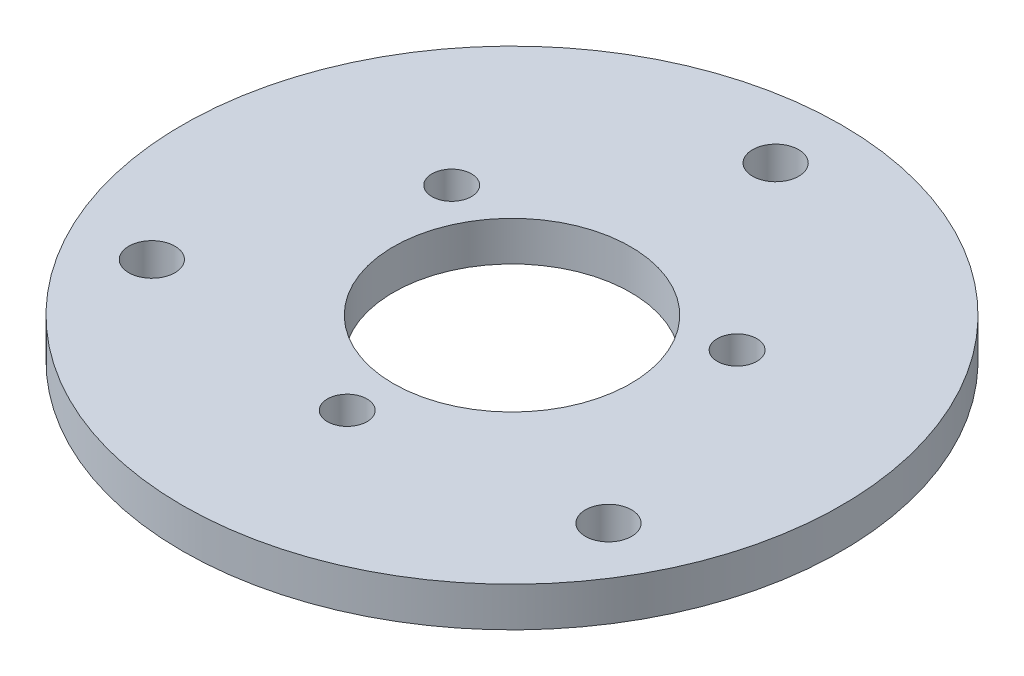
ISO-10303-21;
HEADER;
FILE_DESCRIPTION(('STEP AP214'),'2;1');
FILE_NAME('part.step','',(''),(''),'','','');
FILE_SCHEMA(('AUTOMOTIVE_DESIGN { 1 0 10303 214 1 1 1 1 }'));
ENDSEC;
DATA;
#1=APPLICATION_CONTEXT('core data for automotive mechanical design processes');
#2=APPLICATION_PROTOCOL_DEFINITION('international standard','automotive_design',2000,#1);
#3=PRODUCT_CONTEXT('',#1,'mechanical');
#4=PRODUCT('Part','Part','',(#3));
#5=PRODUCT_RELATED_PRODUCT_CATEGORY('part','',(#4));
#6=PRODUCT_DEFINITION_FORMATION('','',#4);
#7=PRODUCT_DEFINITION_CONTEXT('part definition',#1,'design');
#8=PRODUCT_DEFINITION('design','',#6,#7);
#9=PRODUCT_DEFINITION_SHAPE('','',#8);
#10=(LENGTH_UNIT() NAMED_UNIT(*) SI_UNIT(.MILLI.,.METRE.));
#11=(NAMED_UNIT(*) PLANE_ANGLE_UNIT() SI_UNIT($,.RADIAN.));
#12=(NAMED_UNIT(*) SI_UNIT($,.STERADIAN.) SOLID_ANGLE_UNIT());
#13=UNCERTAINTY_MEASURE_WITH_UNIT(LENGTH_MEASURE(1.E-05),#10,'distance_accuracy_value','');
#14=(GEOMETRIC_REPRESENTATION_CONTEXT(3) GLOBAL_UNCERTAINTY_ASSIGNED_CONTEXT((#13)) GLOBAL_UNIT_ASSIGNED_CONTEXT((#10,
#11,#12)) REPRESENTATION_CONTEXT('',''));
#15=CARTESIAN_POINT('',(0.,0.,0.));
#16=DIRECTION('',(0.,0.,1.));
#17=DIRECTION('',(1.,0.,0.));
#18=AXIS2_PLACEMENT_3D('',#15,#16,#17);
#19=CARTESIAN_POINT('',(0.,3.,0.));
#20=DIRECTION('',(0.,-1.,0.));
#21=DIRECTION('',(0.,0.,-1.));
#22=AXIS2_PLACEMENT_3D('',#19,#20,#21);
#23=CYLINDRICAL_SURFACE('',#22,25.);
#24=CARTESIAN_POINT('',(0.,3.,0.));
#25=DIRECTION('',(0.,1.,0.));
#26=DIRECTION('',(0.,0.,1.));
#27=AXIS2_PLACEMENT_3D('',#24,#25,#26);
#28=CIRCLE('',#27,25.);
#29=CARTESIAN_POINT('',(0.,3.,25.));
#30=VERTEX_POINT('',#29);
#31=EDGE_CURVE('E10',#30,#30,#28,.T.);
#32=ORIENTED_EDGE('',*,*,#31,.F.);
#33=EDGE_LOOP('',(#32));
#34=FACE_BOUND('',#33,.T.);
#35=CARTESIAN_POINT('',(0.,0.,0.));
#36=DIRECTION('',(0.,1.,0.));
#37=DIRECTION('',(0.,0.,1.));
#38=AXIS2_PLACEMENT_3D('',#35,#36,#37);
#39=CIRCLE('',#38,25.);
#40=CARTESIAN_POINT('',(0.,0.,25.));
#41=VERTEX_POINT('',#40);
#42=EDGE_CURVE('E40',#41,#41,#39,.T.);
#43=ORIENTED_EDGE('',*,*,#42,.T.);
#44=EDGE_LOOP('',(#43));
#45=FACE_BOUND('',#44,.T.);
#46=ADVANCED_FACE('F37',(#34,#45),#23,.T.);
#47=CARTESIAN_POINT('',(0.,3.,0.));
#48=DIRECTION('',(0.,1.,0.));
#49=DIRECTION('',(0.,0.,1.));
#50=AXIS2_PLACEMENT_3D('',#47,#48,#49);
#51=PLANE('',#50);
#52=CARTESIAN_POINT('',(-10.8253175473055,3.,-6.25000000000005));
#53=DIRECTION('',(0.,1.,0.));
#54=DIRECTION('',(0.,0.,1.));
#55=AXIS2_PLACEMENT_3D('',#52,#53,#54);
#56=CIRCLE('',#55,1.50000000000001);
#57=CARTESIAN_POINT('',(-10.8253175473055,3.,-4.75000000000004));
#58=VERTEX_POINT('',#57);
#59=EDGE_CURVE('E87',#58,#58,#56,.T.);
#60=ORIENTED_EDGE('',*,*,#59,.F.);
#61=EDGE_LOOP('',(#60));
#62=FACE_BOUND('',#61,.T.);
#63=CARTESIAN_POINT('',(0.,3.,12.5));
#64=DIRECTION('',(0.,1.,0.));
#65=DIRECTION('',(0.,0.,1.));
#66=AXIS2_PLACEMENT_3D('',#63,#64,#65);
#67=CIRCLE('',#66,1.50000000000001);
#68=CARTESIAN_POINT('',(0.,3.,14.));
#69=VERTEX_POINT('',#68);
#70=EDGE_CURVE('E81',#69,#69,#67,.T.);
#71=ORIENTED_EDGE('',*,*,#70,.F.);
#72=EDGE_LOOP('',(#71));
#73=FACE_BOUND('',#72,.T.);
#74=CARTESIAN_POINT('',(10.8253175473055,3.,-6.25000000000006));
#75=DIRECTION('',(0.,1.,0.));
#76=DIRECTION('',(0.,0.,1.));
#77=AXIS2_PLACEMENT_3D('',#74,#75,#76);
#78=CIRCLE('',#77,1.50000000000001);
#79=CARTESIAN_POINT('',(10.8253175473055,3.,-4.75000000000004));
#80=VERTEX_POINT('',#79);
#81=EDGE_CURVE('E75',#80,#80,#78,.T.);
#82=ORIENTED_EDGE('',*,*,#81,.F.);
#83=EDGE_LOOP('',(#82));
#84=FACE_BOUND('',#83,.T.);
#85=CARTESIAN_POINT('',(0.,3.,0.));
#86=DIRECTION('',(0.,1.,0.));
#87=DIRECTION('',(0.,0.,1.));
#88=AXIS2_PLACEMENT_3D('',#85,#86,#87);
#89=CIRCLE('',#88,9.00000000000001);
#90=CARTESIAN_POINT('',(0.,3.,9.00000000000001));
#91=VERTEX_POINT('',#90);
#92=EDGE_CURVE('E69',#91,#91,#89,.T.);
#93=ORIENTED_EDGE('',*,*,#92,.F.);
#94=EDGE_LOOP('',(#93));
#95=FACE_BOUND('',#94,.T.);
#96=CARTESIAN_POINT('',(0.,3.,-20.));
#97=DIRECTION('',(0.,1.,0.));
#98=DIRECTION('',(0.,0.,1.));
#99=AXIS2_PLACEMENT_3D('',#96,#97,#98);
#100=CIRCLE('',#99,1.75000000000001);
#101=CARTESIAN_POINT('',(0.,3.,-18.25));
#102=VERTEX_POINT('',#101);
#103=EDGE_CURVE('E63',#102,#102,#100,.T.);
#104=ORIENTED_EDGE('',*,*,#103,.F.);
#105=EDGE_LOOP('',(#104));
#106=FACE_BOUND('',#105,.T.);
#107=CARTESIAN_POINT('',(-17.3205080756887,3.,10.0000000000001));
#108=DIRECTION('',(0.,1.,0.));
#109=DIRECTION('',(0.,0.,1.));
#110=AXIS2_PLACEMENT_3D('',#107,#108,#109);
#111=CIRCLE('',#110,1.75000000000001);
#112=CARTESIAN_POINT('',(-17.3205080756887,3.,11.7500000000001));
#113=VERTEX_POINT('',#112);
#114=EDGE_CURVE('E57',#113,#113,#111,.T.);
#115=ORIENTED_EDGE('',*,*,#114,.F.);
#116=EDGE_LOOP('',(#115));
#117=FACE_BOUND('',#116,.T.);
#118=CARTESIAN_POINT('',(17.3205080756887,3.,10.0000000000001));
#119=DIRECTION('',(0.,1.,0.));
#120=DIRECTION('',(0.,0.,1.));
#121=AXIS2_PLACEMENT_3D('',#118,#119,#120);
#122=CIRCLE('',#121,1.75000000000001);
#123=CARTESIAN_POINT('',(17.3205080756887,3.,11.7500000000001));
#124=VERTEX_POINT('',#123);
#125=EDGE_CURVE('E51',#124,#124,#122,.T.);
#126=ORIENTED_EDGE('',*,*,#125,.F.);
#127=EDGE_LOOP('',(#126));
#128=FACE_BOUND('',#127,.T.);
#129=ORIENTED_EDGE('',*,*,#31,.T.);
#130=EDGE_LOOP('',(#129));
#131=FACE_BOUND('',#130,.T.);
#132=ADVANCED_FACE('F93',(#62,#73,#84,#95,#106,#117,#128,#131),#51,.T.);
#133=CARTESIAN_POINT('',(0.,0.,0.));
#134=DIRECTION('',(0.,1.,0.));
#135=DIRECTION('',(0.,0.,1.));
#136=AXIS2_PLACEMENT_3D('',#133,#134,#135);
#137=PLANE('',#136);
#138=CARTESIAN_POINT('',(-10.8253175473055,0.,-6.25000000000005));
#139=DIRECTION('',(0.,1.,0.));
#140=DIRECTION('',(0.,0.,1.));
#141=AXIS2_PLACEMENT_3D('',#138,#139,#140);
#142=CIRCLE('',#141,1.50000000000001);
#143=CARTESIAN_POINT('',(-10.8253175473055,0.,-4.75000000000004));
#144=VERTEX_POINT('',#143);
#145=EDGE_CURVE('E84',#144,#144,#142,.T.);
#146=ORIENTED_EDGE('',*,*,#145,.T.);
#147=EDGE_LOOP('',(#146));
#148=FACE_BOUND('',#147,.T.);
#149=CARTESIAN_POINT('',(0.,0.,12.5));
#150=DIRECTION('',(0.,1.,0.));
#151=DIRECTION('',(0.,0.,1.));
#152=AXIS2_PLACEMENT_3D('',#149,#150,#151);
#153=CIRCLE('',#152,1.50000000000001);
#154=CARTESIAN_POINT('',(0.,0.,14.));
#155=VERTEX_POINT('',#154);
#156=EDGE_CURVE('E78',#155,#155,#153,.T.);
#157=ORIENTED_EDGE('',*,*,#156,.T.);
#158=EDGE_LOOP('',(#157));
#159=FACE_BOUND('',#158,.T.);
#160=CARTESIAN_POINT('',(10.8253175473055,0.,-6.25000000000006));
#161=DIRECTION('',(0.,1.,0.));
#162=DIRECTION('',(0.,0.,1.));
#163=AXIS2_PLACEMENT_3D('',#160,#161,#162);
#164=CIRCLE('',#163,1.50000000000001);
#165=CARTESIAN_POINT('',(10.8253175473055,0.,-4.75000000000004));
#166=VERTEX_POINT('',#165);
#167=EDGE_CURVE('E72',#166,#166,#164,.T.);
#168=ORIENTED_EDGE('',*,*,#167,.T.);
#169=EDGE_LOOP('',(#168));
#170=FACE_BOUND('',#169,.T.);
#171=CARTESIAN_POINT('',(0.,0.,0.));
#172=DIRECTION('',(0.,1.,0.));
#173=DIRECTION('',(0.,0.,1.));
#174=AXIS2_PLACEMENT_3D('',#171,#172,#173);
#175=CIRCLE('',#174,9.00000000000001);
#176=CARTESIAN_POINT('',(0.,0.,9.00000000000001));
#177=VERTEX_POINT('',#176);
#178=EDGE_CURVE('E66',#177,#177,#175,.T.);
#179=ORIENTED_EDGE('',*,*,#178,.T.);
#180=EDGE_LOOP('',(#179));
#181=FACE_BOUND('',#180,.T.);
#182=CARTESIAN_POINT('',(0.,0.,-20.));
#183=DIRECTION('',(0.,1.,0.));
#184=DIRECTION('',(0.,0.,1.));
#185=AXIS2_PLACEMENT_3D('',#182,#183,#184);
#186=CIRCLE('',#185,1.75000000000001);
#187=CARTESIAN_POINT('',(0.,0.,-18.25));
#188=VERTEX_POINT('',#187);
#189=EDGE_CURVE('E60',#188,#188,#186,.T.);
#190=ORIENTED_EDGE('',*,*,#189,.T.);
#191=EDGE_LOOP('',(#190));
#192=FACE_BOUND('',#191,.T.);
#193=CARTESIAN_POINT('',(-17.3205080756887,0.,10.0000000000001));
#194=DIRECTION('',(0.,1.,0.));
#195=DIRECTION('',(0.,0.,1.));
#196=AXIS2_PLACEMENT_3D('',#193,#194,#195);
#197=CIRCLE('',#196,1.75000000000001);
#198=CARTESIAN_POINT('',(-17.3205080756887,0.,11.7500000000001));
#199=VERTEX_POINT('',#198);
#200=EDGE_CURVE('E54',#199,#199,#197,.T.);
#201=ORIENTED_EDGE('',*,*,#200,.T.);
#202=EDGE_LOOP('',(#201));
#203=FACE_BOUND('',#202,.T.);
#204=CARTESIAN_POINT('',(17.3205080756887,0.,10.0000000000001));
#205=DIRECTION('',(0.,1.,0.));
#206=DIRECTION('',(0.,0.,1.));
#207=AXIS2_PLACEMENT_3D('',#204,#205,#206);
#208=CIRCLE('',#207,1.75000000000001);
#209=CARTESIAN_POINT('',(17.3205080756887,0.,11.7500000000001));
#210=VERTEX_POINT('',#209);
#211=EDGE_CURVE('E47',#210,#210,#208,.T.);
#212=ORIENTED_EDGE('',*,*,#211,.T.);
#213=EDGE_LOOP('',(#212));
#214=FACE_BOUND('',#213,.T.);
#215=ORIENTED_EDGE('',*,*,#42,.F.);
#216=EDGE_LOOP('',(#215));
#217=FACE_BOUND('',#216,.T.);
#218=ADVANCED_FACE('F96',(#148,#159,#170,#181,#192,#203,#214,#217),#137,.F.);
#219=CARTESIAN_POINT('',(17.3205080756887,3.,10.0000000000001));
#220=DIRECTION('',(0.,1.,0.));
#221=DIRECTION('',(0.,0.,1.));
#222=AXIS2_PLACEMENT_3D('',#219,#220,#221);
#223=CYLINDRICAL_SURFACE('',#222,1.75000000000001);
#224=ORIENTED_EDGE('',*,*,#211,.F.);
#225=EDGE_LOOP('',(#224));
#226=FACE_BOUND('',#225,.T.);
#227=ORIENTED_EDGE('',*,*,#125,.T.);
#228=EDGE_LOOP('',(#227));
#229=FACE_BOUND('',#228,.T.);
#230=ADVANCED_FACE('F110',(#226,#229),#223,.F.);
#231=CARTESIAN_POINT('',(-17.3205080756887,3.,10.0000000000001));
#232=DIRECTION('',(0.,1.,0.));
#233=DIRECTION('',(0.,0.,1.));
#234=AXIS2_PLACEMENT_3D('',#231,#232,#233);
#235=CYLINDRICAL_SURFACE('',#234,1.75000000000001);
#236=ORIENTED_EDGE('',*,*,#200,.F.);
#237=EDGE_LOOP('',(#236));
#238=FACE_BOUND('',#237,.T.);
#239=ORIENTED_EDGE('',*,*,#114,.T.);
#240=EDGE_LOOP('',(#239));
#241=FACE_BOUND('',#240,.T.);
#242=ADVANCED_FACE('F112',(#238,#241),#235,.F.);
#243=CARTESIAN_POINT('',(0.,3.,-20.));
#244=DIRECTION('',(0.,1.,0.));
#245=DIRECTION('',(0.,0.,1.));
#246=AXIS2_PLACEMENT_3D('',#243,#244,#245);
#247=CYLINDRICAL_SURFACE('',#246,1.75000000000001);
#248=ORIENTED_EDGE('',*,*,#189,.F.);
#249=EDGE_LOOP('',(#248));
#250=FACE_BOUND('',#249,.T.);
#251=ORIENTED_EDGE('',*,*,#103,.T.);
#252=EDGE_LOOP('',(#251));
#253=FACE_BOUND('',#252,.T.);
#254=ADVANCED_FACE('F119',(#250,#253),#247,.F.);
#255=CARTESIAN_POINT('',(0.,3.,0.));
#256=DIRECTION('',(0.,1.,0.));
#257=DIRECTION('',(0.,0.,1.));
#258=AXIS2_PLACEMENT_3D('',#255,#256,#257);
#259=CYLINDRICAL_SURFACE('',#258,9.00000000000001);
#260=ORIENTED_EDGE('',*,*,#178,.F.);
#261=EDGE_LOOP('',(#260));
#262=FACE_BOUND('',#261,.T.);
#263=ORIENTED_EDGE('',*,*,#92,.T.);
#264=EDGE_LOOP('',(#263));
#265=FACE_BOUND('',#264,.T.);
#266=ADVANCED_FACE('F165',(#262,#265),#259,.F.);
#267=CARTESIAN_POINT('',(10.8253175473055,3.,-6.25000000000006));
#268=DIRECTION('',(0.,1.,0.));
#269=DIRECTION('',(0.,0.,1.));
#270=AXIS2_PLACEMENT_3D('',#267,#268,#269);
#271=CYLINDRICAL_SURFACE('',#270,1.50000000000001);
#272=ORIENTED_EDGE('',*,*,#167,.F.);
#273=EDGE_LOOP('',(#272));
#274=FACE_BOUND('',#273,.T.);
#275=ORIENTED_EDGE('',*,*,#81,.T.);
#276=EDGE_LOOP('',(#275));
#277=FACE_BOUND('',#276,.T.);
#278=ADVANCED_FACE('F174',(#274,#277),#271,.F.);
#279=CARTESIAN_POINT('',(0.,3.,12.5));
#280=DIRECTION('',(0.,1.,0.));
#281=DIRECTION('',(0.,0.,1.));
#282=AXIS2_PLACEMENT_3D('',#279,#280,#281);
#283=CYLINDRICAL_SURFACE('',#282,1.50000000000001);
#284=ORIENTED_EDGE('',*,*,#156,.F.);
#285=EDGE_LOOP('',(#284));
#286=FACE_BOUND('',#285,.T.);
#287=ORIENTED_EDGE('',*,*,#70,.T.);
#288=EDGE_LOOP('',(#287));
#289=FACE_BOUND('',#288,.T.);
#290=ADVANCED_FACE('F183',(#286,#289),#283,.F.);
#291=CARTESIAN_POINT('',(-10.8253175473055,3.,-6.25000000000005));
#292=DIRECTION('',(0.,1.,0.));
#293=DIRECTION('',(0.,0.,1.));
#294=AXIS2_PLACEMENT_3D('',#291,#292,#293);
#295=CYLINDRICAL_SURFACE('',#294,1.50000000000001);
#296=ORIENTED_EDGE('',*,*,#145,.F.);
#297=EDGE_LOOP('',(#296));
#298=FACE_BOUND('',#297,.T.);
#299=ORIENTED_EDGE('',*,*,#59,.T.);
#300=EDGE_LOOP('',(#299));
#301=FACE_BOUND('',#300,.T.);
#302=ADVANCED_FACE('F91',(#298,#301),#295,.F.);
#303=CLOSED_SHELL('',(#46,#132,#218,#230,#242,#254,#266,#278,#290,#302));
#304=MANIFOLD_SOLID_BREP('B2',#303);
#305=ADVANCED_BREP_SHAPE_REPRESENTATION('',(#18,#304),#14);
#306=SHAPE_DEFINITION_REPRESENTATION(#9,#305);
ENDSEC;
END-ISO-10303-21;
